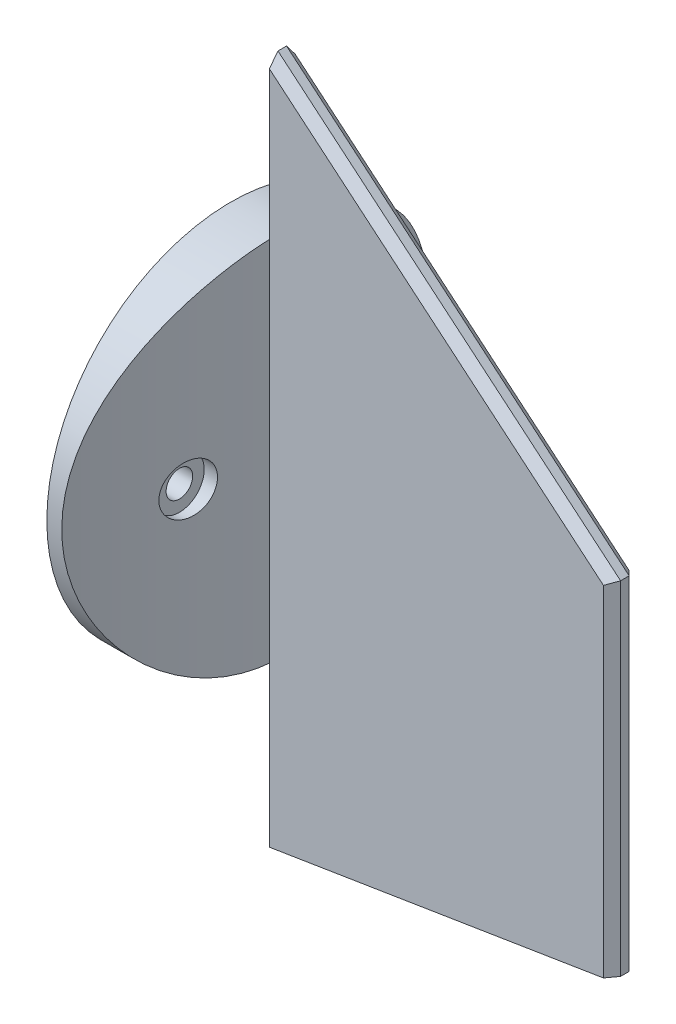
ISO-10303-21;
HEADER;
FILE_DESCRIPTION(('STEP AP214'),'2;1');
FILE_NAME('part.step','',(''),(''),'','','');
FILE_SCHEMA(('AUTOMOTIVE_DESIGN { 1 0 10303 214 1 1 1 1 }'));
ENDSEC;
DATA;
#1=APPLICATION_CONTEXT('core data for automotive mechanical design processes');
#2=APPLICATION_PROTOCOL_DEFINITION('international standard','automotive_design',2000,#1);
#3=PRODUCT_CONTEXT('',#1,'mechanical');
#4=PRODUCT('Part','Part','',(#3));
#5=PRODUCT_RELATED_PRODUCT_CATEGORY('part','',(#4));
#6=PRODUCT_DEFINITION_FORMATION('','',#4);
#7=PRODUCT_DEFINITION_CONTEXT('part definition',#1,'design');
#8=PRODUCT_DEFINITION('design','',#6,#7);
#9=PRODUCT_DEFINITION_SHAPE('','',#8);
#10=(LENGTH_UNIT() NAMED_UNIT(*) SI_UNIT(.MILLI.,.METRE.));
#11=(NAMED_UNIT(*) PLANE_ANGLE_UNIT() SI_UNIT($,.RADIAN.));
#12=(NAMED_UNIT(*) SI_UNIT($,.STERADIAN.) SOLID_ANGLE_UNIT());
#13=UNCERTAINTY_MEASURE_WITH_UNIT(LENGTH_MEASURE(1.E-05),#10,'distance_accuracy_value','');
#14=(GEOMETRIC_REPRESENTATION_CONTEXT(3) GLOBAL_UNCERTAINTY_ASSIGNED_CONTEXT((#13)) GLOBAL_UNIT_ASSIGNED_CONTEXT((#10,
#11,#12)) REPRESENTATION_CONTEXT('',''));
#15=CARTESIAN_POINT('',(0.,0.,0.));
#16=DIRECTION('',(0.,0.,1.));
#17=DIRECTION('',(1.,0.,0.));
#18=AXIS2_PLACEMENT_3D('',#15,#16,#17);
#19=CARTESIAN_POINT('',(16.1628836517053,19.2621746586022,-1.143));
#20=DIRECTION('',(0.642787609686535,0.766044443118982,0.));
#21=DIRECTION('',(-0.766044443118982,0.642787609686535,0.));
#22=AXIS2_PLACEMENT_3D('',#19,#20,#21);
#23=PLANE('',#22);
#24=DIRECTION('',(0.,0.,1.));
#25=VECTOR('',#24,1.);
#26=CARTESIAN_POINT('',(33.274,4.90424324171679,-1.143));
#27=LINE('',#26,#25);
#28=CARTESIAN_POINT('',(33.274,4.90424324171679,-0.380999999999998));
#29=VERTEX_POINT('',#28);
#30=CARTESIAN_POINT('',(33.274,4.90424324171679,0.381000000000004));
#31=VERTEX_POINT('',#30);
#32=EDGE_CURVE('E153',#29,#31,#27,.T.);
#33=ORIENTED_EDGE('',*,*,#32,.F.);
#34=DIRECTION('',(-0.766044443118982,0.642787609686535,0.));
#35=VECTOR('',#34,1.);
#36=CARTESIAN_POINT('',(16.1628836517053,19.2621746586022,-0.380999999999998));
#37=LINE('',#36,#35);
#38=CARTESIAN_POINT('',(2.794,30.48,-0.380999999999998));
#39=VERTEX_POINT('',#38);
#40=EDGE_CURVE('E84',#29,#39,#37,.T.);
#41=ORIENTED_EDGE('',*,*,#40,.T.);
#42=DIRECTION('',(0.,0.,1.));
#43=VECTOR('',#42,1.);
#44=CARTESIAN_POINT('',(2.794,30.48,-1.143));
#45=LINE('',#44,#43);
#46=CARTESIAN_POINT('',(2.794,30.48,0.381000000000004));
#47=VERTEX_POINT('',#46);
#48=EDGE_CURVE('E130',#39,#47,#45,.T.);
#49=ORIENTED_EDGE('',*,*,#48,.T.);
#50=DIRECTION('',(0.766044443118982,-0.642787609686535,0.));
#51=VECTOR('',#50,1.);
#52=CARTESIAN_POINT('',(33.274,4.9042432417168,0.381000000000004));
#53=LINE('',#52,#51);
#54=EDGE_CURVE('E173',#47,#31,#53,.T.);
#55=ORIENTED_EDGE('',*,*,#54,.T.);
#56=EDGE_LOOP('',(#33,#41,#49,#55));
#57=FACE_BOUND('',#56,.T.);
#58=ADVANCED_FACE('F60',(#57),#23,.T.);
#59=CARTESIAN_POINT('',(33.274,0.,-1.143));
#60=DIRECTION('',(1.,0.,0.));
#61=DIRECTION('',(0.,0.,-1.));
#62=AXIS2_PLACEMENT_3D('',#59,#60,#61);
#63=PLANE('',#62);
#64=ORIENTED_EDGE('',*,*,#32,.T.);
#65=DIRECTION('',(0.,-1.,0.));
#66=VECTOR('',#65,1.);
#67=CARTESIAN_POINT('',(33.274,-25.5757567582832,0.381));
#68=LINE('',#67,#66);
#69=CARTESIAN_POINT('',(33.274,-25.5757567582832,0.381));
#70=VERTEX_POINT('',#69);
#71=EDGE_CURVE('E164',#31,#70,#68,.T.);
#72=ORIENTED_EDGE('',*,*,#71,.T.);
#73=DIRECTION('',(0.,0.,1.));
#74=VECTOR('',#73,1.);
#75=CARTESIAN_POINT('',(33.274,-25.5757567582832,-1.143));
#76=LINE('',#75,#74);
#77=CARTESIAN_POINT('',(33.274,-25.5757567582832,-0.381));
#78=VERTEX_POINT('',#77);
#79=EDGE_CURVE('E140',#78,#70,#76,.T.);
#80=ORIENTED_EDGE('',*,*,#79,.F.);
#81=DIRECTION('',(0.,1.,0.));
#82=VECTOR('',#81,1.);
#83=CARTESIAN_POINT('',(33.274,0.,-0.381));
#84=LINE('',#83,#82);
#85=EDGE_CURVE('E161',#78,#29,#84,.T.);
#86=ORIENTED_EDGE('',*,*,#85,.T.);
#87=EDGE_LOOP('',(#64,#72,#80,#86));
#88=FACE_BOUND('',#87,.T.);
#89=ADVANCED_FACE('F188',(#88),#63,.T.);
#90=CARTESIAN_POINT('',(4.85098997494497,-30.1490295543667,-1.143));
#91=DIRECTION('',(0.158857187077337,-0.987301572020361,0.));
#92=DIRECTION('',(0.987301572020361,0.158857187077337,0.));
#93=AXIS2_PLACEMENT_3D('',#90,#91,#92);
#94=PLANE('',#93);
#95=ORIENTED_EDGE('',*,*,#79,.T.);
#96=DIRECTION('',(-0.702574178847774,-0.113044444501933,0.702574178847775));
#97=VECTOR('',#96,1.);
#98=CARTESIAN_POINT('',(19.6331478716564,-27.77057489679,14.0218521283436));
#99=LINE('',#98,#97);
#100=CARTESIAN_POINT('',(32.512,-25.6983628393261,1.143));
#101=VERTEX_POINT('',#100);
#102=EDGE_CURVE('E168',#70,#101,#99,.T.);
#103=ORIENTED_EDGE('',*,*,#102,.T.);
#104=DIRECTION('',(0.987301572020361,0.158857187077337,0.));
#105=VECTOR('',#104,1.);
#106=CARTESIAN_POINT('',(4.85098997494497,-30.1490295543667,1.143));
#107=LINE('',#106,#105);
#108=CARTESIAN_POINT('',(2.794,-30.48,1.143));
#109=VERTEX_POINT('',#108);
#110=EDGE_CURVE('E139',#109,#101,#107,.T.);
#111=ORIENTED_EDGE('',*,*,#110,.F.);
#112=DIRECTION('',(0.,0.,1.));
#113=VECTOR('',#112,1.);
#114=CARTESIAN_POINT('',(2.794,-30.48,-1.143));
#115=LINE('',#114,#113);
#116=CARTESIAN_POINT('',(2.794,-30.48,-1.143));
#117=VERTEX_POINT('',#116);
#118=EDGE_CURVE('E124',#117,#109,#115,.T.);
#119=ORIENTED_EDGE('',*,*,#118,.F.);
#120=DIRECTION('',(0.987301572020361,0.158857187077337,0.));
#121=VECTOR('',#120,1.);
#122=CARTESIAN_POINT('',(4.85098997494497,-30.1490295543667,-1.143));
#123=LINE('',#122,#121);
#124=CARTESIAN_POINT('',(32.512,-25.6983628393261,-1.143));
#125=VERTEX_POINT('',#124);
#126=EDGE_CURVE('E131',#117,#125,#123,.T.);
#127=ORIENTED_EDGE('',*,*,#126,.T.);
#128=DIRECTION('',(-0.702574178847774,-0.113044444501933,-0.702574178847775));
#129=VECTOR('',#128,1.);
#130=CARTESIAN_POINT('',(18.504754321729,-27.9521338351505,-15.150245678271));
#131=LINE('',#130,#129);
#132=EDGE_CURVE('E166',#125,#78,#131,.F.);
#133=ORIENTED_EDGE('',*,*,#132,.T.);
#134=EDGE_LOOP('',(#95,#103,#111,#119,#127,#133));
#135=FACE_BOUND('',#134,.T.);
#136=ADVANCED_FACE('F136',(#135),#94,.T.);
#137=CARTESIAN_POINT('',(2.794,0.,-1.143));
#138=DIRECTION('',(-1.,0.,0.));
#139=DIRECTION('',(0.,-1.,0.));
#140=AXIS2_PLACEMENT_3D('',#137,#138,#139);
#141=PLANE('',#140);
#142=ORIENTED_EDGE('',*,*,#48,.F.);
#143=DIRECTION('',(0.,0.793844806099445,0.608120402411344));
#144=VECTOR('',#143,1.);
#145=CARTESIAN_POINT('',(2.794,10.9039637624277,-15.3771137780881));
#146=LINE('',#145,#144);
#147=CARTESIAN_POINT('',(2.794,29.4852796455288,-1.143));
#148=VERTEX_POINT('',#147);
#149=EDGE_CURVE('E14',#39,#148,#146,.F.);
#150=ORIENTED_EDGE('',*,*,#149,.T.);
#151=DIRECTION('',(0.,-1.,0.));
#152=VECTOR('',#151,1.);
#153=CARTESIAN_POINT('',(2.794,0.,-1.143));
#154=LINE('',#153,#152);
#155=EDGE_CURVE('E121',#148,#117,#154,.T.);
#156=ORIENTED_EDGE('',*,*,#155,.T.);
#157=ORIENTED_EDGE('',*,*,#118,.T.);
#158=DIRECTION('',(0.,-1.,0.));
#159=VECTOR('',#158,1.);
#160=CARTESIAN_POINT('',(2.794,0.,1.143));
#161=LINE('',#160,#159);
#162=CARTESIAN_POINT('',(2.794,29.4852796455288,1.143));
#163=VERTEX_POINT('',#162);
#164=EDGE_CURVE('E145',#163,#109,#161,.T.);
#165=ORIENTED_EDGE('',*,*,#164,.F.);
#166=DIRECTION('',(0.,0.793844806099445,-0.608120402411344));
#167=VECTOR('',#166,1.);
#168=CARTESIAN_POINT('',(2.794,12.0075376300625,14.5317271492151));
#169=LINE('',#168,#167);
#170=EDGE_CURVE('E70',#163,#47,#169,.T.);
#171=ORIENTED_EDGE('',*,*,#170,.T.);
#172=EDGE_LOOP('',(#142,#150,#156,#157,#165,#171));
#173=FACE_BOUND('',#172,.T.);
#174=ADVANCED_FACE('F123',(#173),#141,.T.);
#175=CARTESIAN_POINT('',(0.,0.,-1.143));
#176=DIRECTION('',(0.,0.,-1.));
#177=DIRECTION('',(-1.,0.,0.));
#178=AXIS2_PLACEMENT_3D('',#175,#176,#177);
#179=PLANE('',#178);
#180=DIRECTION('',(0.766044443118982,-0.642787609686535,0.));
#181=VECTOR('',#180,1.);
#182=CARTESIAN_POINT('',(15.6730794931242,18.6784487929456,-1.143));
#183=LINE('',#182,#181);
#184=CARTESIAN_POINT('',(32.512,4.54891680620268,-1.143));
#185=VERTEX_POINT('',#184);
#186=EDGE_CURVE('E170',#148,#185,#183,.T.);
#187=ORIENTED_EDGE('',*,*,#186,.T.);
#188=DIRECTION('',(0.,-1.,0.));
#189=VECTOR('',#188,1.);
#190=CARTESIAN_POINT('',(32.512,0.,-1.143));
#191=LINE('',#190,#189);
#192=EDGE_CURVE('E144',#185,#125,#191,.T.);
#193=ORIENTED_EDGE('',*,*,#192,.T.);
#194=ORIENTED_EDGE('',*,*,#126,.F.);
#195=ORIENTED_EDGE('',*,*,#155,.F.);
#196=EDGE_LOOP('',(#187,#193,#194,#195));
#197=FACE_BOUND('',#196,.T.);
#198=ADVANCED_FACE('F142',(#197),#179,.T.);
#199=CARTESIAN_POINT('',(0.,0.,1.143));
#200=DIRECTION('',(0.,0.,-1.));
#201=DIRECTION('',(-1.,0.,0.));
#202=AXIS2_PLACEMENT_3D('',#199,#200,#201);
#203=PLANE('',#202);
#204=ORIENTED_EDGE('',*,*,#110,.T.);
#205=DIRECTION('',(0.,1.,0.));
#206=VECTOR('',#205,1.);
#207=CARTESIAN_POINT('',(32.512,4.90424324171679,1.143));
#208=LINE('',#207,#206);
#209=CARTESIAN_POINT('',(32.512,4.54891680620268,1.143));
#210=VERTEX_POINT('',#209);
#211=EDGE_CURVE('E158',#101,#210,#208,.T.);
#212=ORIENTED_EDGE('',*,*,#211,.T.);
#213=DIRECTION('',(-0.766044443118982,0.642787609686535,0.));
#214=VECTOR('',#213,1.);
#215=CARTESIAN_POINT('',(2.30419584141886,29.8962741343433,1.143));
#216=LINE('',#215,#214);
#217=EDGE_CURVE('E156',#210,#163,#216,.T.);
#218=ORIENTED_EDGE('',*,*,#217,.T.);
#219=ORIENTED_EDGE('',*,*,#164,.T.);
#220=EDGE_LOOP('',(#204,#212,#218,#219));
#221=FACE_BOUND('',#220,.T.);
#222=ADVANCED_FACE('F193',(#221),#203,.F.);
#223=CARTESIAN_POINT('',(15.6730794931242,18.6784487929456,1.143));
#224=DIRECTION('',(0.45451947767204,0.541675220419704,0.707106781186548));
#225=DIRECTION('',(0.766044443118982,-0.642787609686535,0.));
#226=AXIS2_PLACEMENT_3D('',#223,#224,#225);
#227=PLANE('',#226);
#228=ORIENTED_EDGE('',*,*,#170,.F.);
#229=ORIENTED_EDGE('',*,*,#217,.F.);
#230=DIRECTION('',(0.671542934237816,0.313145613014978,-0.671542934237817));
#231=VECTOR('',#230,1.);
#232=CARTESIAN_POINT('',(27.8894630005605,2.39339240325919,5.76553699943948));
#233=LINE('',#232,#231);
#234=EDGE_CURVE('E149',#31,#210,#233,.F.);
#235=ORIENTED_EDGE('',*,*,#234,.F.);
#236=ORIENTED_EDGE('',*,*,#54,.F.);
#237=EDGE_LOOP('',(#228,#229,#235,#236));
#238=FACE_BOUND('',#237,.T.);
#239=ADVANCED_FACE('F191',(#238),#227,.T.);
#240=CARTESIAN_POINT('',(32.512,0.,1.143));
#241=DIRECTION('',(0.707106781186548,0.,0.707106781186547));
#242=DIRECTION('',(0.,-1.,0.));
#243=AXIS2_PLACEMENT_3D('',#240,#241,#242);
#244=PLANE('',#243);
#245=ORIENTED_EDGE('',*,*,#102,.F.);
#246=ORIENTED_EDGE('',*,*,#71,.F.);
#247=ORIENTED_EDGE('',*,*,#234,.T.);
#248=ORIENTED_EDGE('',*,*,#211,.F.);
#249=EDGE_LOOP('',(#245,#246,#247,#248));
#250=FACE_BOUND('',#249,.T.);
#251=ADVANCED_FACE('F195',(#250),#244,.T.);
#252=CARTESIAN_POINT('',(16.1628836517053,19.2621746586022,-0.381));
#253=DIRECTION('',(-0.45451947767204,-0.541675220419704,0.707106781186548));
#254=DIRECTION('',(-0.766044443118982,0.642787609686535,0.));
#255=AXIS2_PLACEMENT_3D('',#252,#253,#254);
#256=PLANE('',#255);
#257=ORIENTED_EDGE('',*,*,#149,.F.);
#258=ORIENTED_EDGE('',*,*,#40,.F.);
#259=DIRECTION('',(-0.671542934237816,-0.313145613014978,-0.671542934237818));
#260=VECTOR('',#259,1.);
#261=CARTESIAN_POINT('',(28.5767411472482,2.71387546634224,-5.07825885275177));
#262=LINE('',#261,#260);
#263=EDGE_CURVE('E65',#185,#29,#262,.F.);
#264=ORIENTED_EDGE('',*,*,#263,.F.);
#265=ORIENTED_EDGE('',*,*,#186,.F.);
#266=EDGE_LOOP('',(#257,#258,#264,#265));
#267=FACE_BOUND('',#266,.T.);
#268=ADVANCED_FACE('F63',(#267),#256,.F.);
#269=CARTESIAN_POINT('',(33.274,0.,-0.381));
#270=DIRECTION('',(-0.707106781186548,0.,0.707106781186547));
#271=DIRECTION('',(0.,1.,0.));
#272=AXIS2_PLACEMENT_3D('',#269,#270,#271);
#273=PLANE('',#272);
#274=ORIENTED_EDGE('',*,*,#132,.F.);
#275=ORIENTED_EDGE('',*,*,#192,.F.);
#276=ORIENTED_EDGE('',*,*,#263,.T.);
#277=ORIENTED_EDGE('',*,*,#85,.F.);
#278=EDGE_LOOP('',(#274,#275,#276,#277));
#279=FACE_BOUND('',#278,.T.);
#280=ADVANCED_FACE('F184',(#279),#273,.F.);
#281=CLOSED_SHELL('',(#58,#89,#136,#174,#198,#222,#239,#251,#268,#280));
#282=MANIFOLD_SOLID_BREP('B2',#281);
#283=CARTESIAN_POINT('',(-0.9398,0.,0.));
#284=DIRECTION('',(1.,0.,0.));
#285=DIRECTION('',(0.,0.,-1.));
#286=AXIS2_PLACEMENT_3D('',#283,#284,#285);
#287=CYLINDRICAL_SURFACE('',#286,5.4102);
#288=CARTESIAN_POINT('',(-1.778,0.,0.));
#289=DIRECTION('',(-1.,0.,0.));
#290=DIRECTION('',(0.,0.,1.));
#291=AXIS2_PLACEMENT_3D('',#288,#289,#290);
#292=CIRCLE('',#291,5.4102);
#293=CARTESIAN_POINT('',(-1.778,0.,5.4102));
#294=VERTEX_POINT('',#293);
#295=EDGE_CURVE('E394',#294,#294,#292,.T.);
#296=ORIENTED_EDGE('',*,*,#295,.T.);
#297=EDGE_LOOP('',(#296));
#298=FACE_BOUND('',#297,.T.);
#299=CARTESIAN_POINT('',(1.016,0.,0.));
#300=DIRECTION('',(-1.,0.,0.));
#301=DIRECTION('',(0.,0.,1.));
#302=AXIS2_PLACEMENT_3D('',#299,#300,#301);
#303=CIRCLE('',#302,5.4102);
#304=CARTESIAN_POINT('',(1.016,0.,5.4102));
#305=VERTEX_POINT('',#304);
#306=EDGE_CURVE('E393',#305,#305,#303,.F.);
#307=ORIENTED_EDGE('',*,*,#306,.T.);
#308=EDGE_LOOP('',(#307));
#309=FACE_BOUND('',#308,.T.);
#310=ADVANCED_FACE('F295',(#298,#309),#287,.F.);
#311=CARTESIAN_POINT('',(-1.778,0.,0.));
#312=DIRECTION('',(-1.,0.,0.));
#313=DIRECTION('',(0.,0.,1.));
#314=AXIS2_PLACEMENT_3D('',#311,#312,#313);
#315=PLANE('',#314);
#316=CARTESIAN_POINT('',(-1.778,0.,-7.62482003100001));
#317=DIRECTION('',(-1.,0.,0.));
#318=DIRECTION('',(0.,0.,1.));
#319=AXIS2_PLACEMENT_3D('',#316,#317,#318);
#320=CIRCLE('',#319,1.1811);
#321=CARTESIAN_POINT('',(-1.778,0.,-6.44372003100001));
#322=VERTEX_POINT('',#321);
#323=EDGE_CURVE('E396',#322,#322,#320,.T.);
#324=ORIENTED_EDGE('',*,*,#323,.F.);
#325=EDGE_LOOP('',(#324));
#326=FACE_BOUND('',#325,.T.);
#327=CARTESIAN_POINT('',(-1.778,0.,0.));
#328=DIRECTION('',(-1.,0.,0.));
#329=DIRECTION('',(0.,0.,1.));
#330=AXIS2_PLACEMENT_3D('',#327,#328,#329);
#331=CIRCLE('',#330,16.367500031);
#332=CARTESIAN_POINT('',(-1.778,0.,16.367500031));
#333=VERTEX_POINT('',#332);
#334=EDGE_CURVE('E330',#333,#333,#331,.T.);
#335=ORIENTED_EDGE('',*,*,#334,.T.);
#336=EDGE_LOOP('',(#335));
#337=FACE_BOUND('',#336,.T.);
#338=CARTESIAN_POINT('',(-1.778,0.,7.62482003100001));
#339=DIRECTION('',(-1.,0.,0.));
#340=DIRECTION('',(0.,0.,1.));
#341=AXIS2_PLACEMENT_3D('',#338,#339,#340);
#342=CIRCLE('',#341,1.1811);
#343=CARTESIAN_POINT('',(-1.778,0.,8.80592003100001));
#344=VERTEX_POINT('',#343);
#345=EDGE_CURVE('E400',#344,#344,#342,.T.);
#346=ORIENTED_EDGE('',*,*,#345,.F.);
#347=EDGE_LOOP('',(#346));
#348=FACE_BOUND('',#347,.T.);
#349=ORIENTED_EDGE('',*,*,#295,.F.);
#350=EDGE_LOOP('',(#349));
#351=FACE_BOUND('',#350,.T.);
#352=ADVANCED_FACE('F338',(#326,#337,#348,#351),#315,.T.);
#353=CARTESIAN_POINT('',(-40.095840306,52.8319999999999,0.));
#354=DIRECTION('',(0.,-1.,0.));
#355=DIRECTION('',(0.,0.,-1.));
#356=AXIS2_PLACEMENT_3D('',#353,#354,#355);
#357=CYLINDRICAL_SURFACE('',#356,42.889840306);
#358=CARTESIAN_POINT('',(1.65123923640673,0.,-9.83462003100001));
#359=CARTESIAN_POINT('',(1.65124090493236,-0.121723263479256,-9.83461473170668));
#360=CARTESIAN_POINT('',(1.65362331999181,-0.24361646545623,-9.82451669951309));
#361=CARTESIAN_POINT('',(1.66304179473204,-0.484071798545726,-9.78440474082203));
#362=CARTESIAN_POINT('',(1.67008801002888,-0.60262607034073,-9.75434735154099));
#363=CARTESIAN_POINT('',(1.68846480315277,-0.832716651604852,-9.67532327176787));
#364=CARTESIAN_POINT('',(1.69978897156905,-0.944263170218925,-9.62638486729045));
#365=CARTESIAN_POINT('',(1.72616179018139,-1.15743141954963,-9.5111523137065));
#366=CARTESIAN_POINT('',(1.74120889976679,-1.25905723141008,-9.44486534305095));
#367=CARTESIAN_POINT('',(1.77456103149235,-1.45109086448671,-9.29590118356578));
#368=CARTESIAN_POINT('',(1.79290670266065,-1.54133160494938,-9.21301783027845));
#369=CARTESIAN_POINT('',(1.83192074067876,-1.70670673527771,-9.03380609372992));
#370=CARTESIAN_POINT('',(1.85258957336221,-1.78183808699815,-8.93747501302877));
#371=CARTESIAN_POINT('',(1.89593570307429,-1.9167172743674,-8.73157834471528));
#372=CARTESIAN_POINT('',(1.91864914504905,-1.97605547733748,-8.62175190966475));
#373=CARTESIAN_POINT('',(1.964779660835,-2.07540842874624,-8.3938169103199));
#374=CARTESIAN_POINT('',(1.98819679496326,-2.1154215156831,-8.27570763489705));
#375=CARTESIAN_POINT('',(2.03527928488527,-2.17550896913286,-8.0326028935171));
#376=CARTESIAN_POINT('',(2.05894306584235,-2.19527389254562,-7.90753049483763));
#377=CARTESIAN_POINT('',(2.10540722034292,-2.21318785749976,-7.65568437231601));
#378=CARTESIAN_POINT('',(2.12820758233017,-2.21133660982661,-7.52891062573325));
#379=CARTESIAN_POINT('',(2.17230132914126,-2.18596071733981,-7.27728792170877));
#380=CARTESIAN_POINT('',(2.19359483948715,-2.16243788008219,-7.15243880462302));
#381=CARTESIAN_POINT('',(2.2341613843216,-2.09424977318596,-6.90830496973448));
#382=CARTESIAN_POINT('',(2.25343450606202,-2.0495854170181,-6.78902001176327));
#383=CARTESIAN_POINT('',(2.28938124241434,-1.94086540100623,-6.56083892551603));
#384=CARTESIAN_POINT('',(2.3060808461004,-1.87702589247168,-6.45184393038169));
#385=CARTESIAN_POINT('',(2.33687957748199,-1.7315211537319,-6.24608055642361));
#386=CARTESIAN_POINT('',(2.35097910815996,-1.64985869017796,-6.14931028363718));
#387=CARTESIAN_POINT('',(2.37626734323462,-1.47220211311279,-5.97213489279955));
#388=CARTESIAN_POINT('',(2.38749230320028,-1.37641328784823,-5.89152904202702));
#389=CARTESIAN_POINT('',(2.40721897450267,-1.17236895752072,-5.74749151314544));
#390=CARTESIAN_POINT('',(2.41571955722137,-1.0641083109832,-5.68406695434826));
#391=CARTESIAN_POINT('',(2.42991693515785,-0.839302464759715,-5.57685243955172));
#392=CARTESIAN_POINT('',(2.43563784839463,-0.722838948397243,-5.53289389219598));
#393=CARTESIAN_POINT('',(2.44439168883627,-0.484261529759884,-5.46518495316809));
#394=CARTESIAN_POINT('',(2.44743036660701,-0.36216030918075,-5.44139133338875));
#395=CARTESIAN_POINT('',(2.44969089769505,-0.199378778292938,-5.42366884137227));
#396=CARTESIAN_POINT('',(2.45010388878268,-0.159577867125906,-5.42042793362256));
#397=CARTESIAN_POINT('',(2.45065470711853,-0.0798570519826655,-5.41610267137195));
#398=CARTESIAN_POINT('',(2.45079253424848,-0.0399371479553198,-5.41501831779795));
#399=CARTESIAN_POINT('',(2.45079222198178,0.123202682239974,-5.41502531608168));
#400=CARTESIAN_POINT('',(2.44947959966393,0.246569469713518,-5.42536636933804));
#401=CARTESIAN_POINT('',(2.44421635351448,0.489970986763301,-5.46647924044991));
#402=CARTESIAN_POINT('',(2.44026017230809,0.609998140794525,-5.49729409822086));
#403=CARTESIAN_POINT('',(2.42969496072536,0.843038194641958,-5.57843297927342));
#404=CARTESIAN_POINT('',(2.42308841090257,0.956057539383714,-5.62873875895838));
#405=CARTESIAN_POINT('',(2.40721899317267,1.17194250541552,-5.7473396386006));
#406=CARTESIAN_POINT('',(2.39795735267357,1.27481278899353,-5.81562642502626));
#407=CARTESIAN_POINT('',(2.37676990619326,1.4678766539148,-5.96839408424807));
#408=CARTESIAN_POINT('',(2.36483688513589,1.55803480581141,-6.05291872413217));
#409=CARTESIAN_POINT('',(2.33839853471997,1.72288254413611,-6.23556522860688));
#410=CARTESIAN_POINT('',(2.32389291843296,1.79757040310437,-6.33368860963453));
#411=CARTESIAN_POINT('',(2.29234907824378,1.92999345732127,-6.54147620732075));
#412=CARTESIAN_POINT('',(2.27529243564043,1.9875954300748,-6.65122250465698));
#413=CARTESIAN_POINT('',(2.23899476606412,2.0836021914911,-6.8784716028277));
#414=CARTESIAN_POINT('',(2.21975363242519,2.1220060422384,-6.99597478230371));
#415=CARTESIAN_POINT('',(2.1792263051758,2.17903864879861,-7.2368659574205));
#416=CARTESIAN_POINT('',(2.1579184601324,2.19742612157519,-7.36030742044492));
#417=CARTESIAN_POINT('',(2.11397100683158,2.21322912397292,-7.60829089112522));
#418=CARTESIAN_POINT('',(2.09133129310549,2.21064299050071,-7.73283298527303));
#419=CARTESIAN_POINT('',(2.04505754538407,2.18449310446752,-7.98118340912612));
#420=CARTESIAN_POINT('',(2.02141447601561,2.16066038457447,-8.10496177686636));
#421=CARTESIAN_POINT('',(1.97417544823959,2.0923402630411,-8.34669727486986));
#422=CARTESIAN_POINT('',(1.95057949325134,2.04785141336171,-8.46465399638178));
#423=CARTESIAN_POINT('',(1.90414045338888,1.93907274101994,-8.69215688712455));
#424=CARTESIAN_POINT('',(1.88130294731311,1.87466178929059,-8.8016463391349));
#425=CARTESIAN_POINT('',(1.83745737907376,1.72784863549205,-9.00822472805835));
#426=CARTESIAN_POINT('',(1.81644912221774,1.6454483513633,-9.10531498516931));
#427=CARTESIAN_POINT('',(1.77735399506801,1.46563194978267,-9.28344033985892));
#428=CARTESIAN_POINT('',(1.75924410957872,1.3683475106771,-9.36460321361671));
#429=CARTESIAN_POINT('',(1.72658928869166,1.16088131449001,-9.50938033448004));
#430=CARTESIAN_POINT('',(1.71204563352437,1.05069494669518,-9.57298828061953));
#431=CARTESIAN_POINT('',(1.68754102408532,0.823083609925416,-9.67937892269558));
#432=CARTESIAN_POINT('',(1.67749042235978,0.705858719697059,-9.72257009559211));
#433=CARTESIAN_POINT('',(1.66207643546337,0.465697615563304,-9.78856267986493));
#434=CARTESIAN_POINT('',(1.65670202686647,0.342775557006191,-9.81141204697337));
#435=CARTESIAN_POINT('',(1.65294626910597,0.182559782974134,-9.82737118451738));
#436=CARTESIAN_POINT('',(1.65230679959527,0.146107882189118,-9.83008739658524));
#437=CARTESIAN_POINT('',(1.65145303242641,0.0731090984650256,-9.8337126166844));
#438=CARTESIAN_POINT('',(1.65123873522897,0.0365622154230704,-9.8346216227574));
#439=CARTESIAN_POINT('',(1.65123923640673,0.,-9.83462003100001));
#440=B_SPLINE_CURVE_WITH_KNOTS('',3,(#358,#359,#360,#361,#362,#363,#364,#365,#366,#367,#368,
#369,#370,#371,#372,#373,#374,#375,#376,#377,#378,#379,#380,#381,#382,#383,#384,#385,#386,#387,
#388,#389,#390,#391,#392,#393,#394,#395,#396,#397,#398,#399,#400,#401,#402,#403,#404,#405,#406,
#407,#408,#409,#410,#411,#412,#413,#414,#415,#416,#417,#418,#419,#420,#421,#422,#423,#424,#425,
#426,#427,#428,#429,#430,#431,#432,#433,#434,#435,#436,#437,#438,#439),.UNSPECIFIED.,.T.,.F.,(4,
2,2,2,2,2,2,2,2,2,2,2,2,2,2,2,2,2,2,2,2,2,2,2,2,2,2,2,2,2,2,2,2,2,2,2,2,2,2,2,4),(0.,
0.365028233526957,0.730853957577828,1.09613374588538,1.46126262784271,1.83124522919189,
2.20130215118106,2.58018491938728,2.95910025673257,3.34372368729796,3.72835226395604,
4.11294876291359,4.49752864596058,4.87792643763192,5.25826522222754,5.63354015415093,
6.00897034952752,6.3810821918068,6.75239429528886,6.87215640254757,6.9919185612805,
7.36137456758455,7.73160971000847,8.10149914449368,8.47121785970403,8.84194745325271,
9.21271842130228,9.58630864831107,9.95991712511614,10.3379809513626,10.7160747563158,
11.0990240282616,11.4820001498281,11.8673521794359,12.2526631446169,12.6347438139049,
13.0169614450545,13.3911693930552,13.7644927930035,13.8741368007821,13.9837809273709),.UNSPECIFIED.);
#441=CARTESIAN_POINT('',(1.65123923640673,0.,-9.83462003100001));
#442=VERTEX_POINT('',#441);
#443=EDGE_CURVE('E59',#442,#442,#440,.T.);
#444=ORIENTED_EDGE('',*,*,#443,.T.);
#445=EDGE_LOOP('',(#444));
#446=FACE_BOUND('',#445,.T.);
#447=CARTESIAN_POINT('',(2.4507924578046,0.,5.41502003100001));
#448=CARTESIAN_POINT('',(2.45079223647605,0.123304288673363,5.41502554931877));
#449=CARTESIAN_POINT('',(2.44947837581417,0.246696326644531,5.42537614682885));
#450=CARTESIAN_POINT('',(2.44421266941021,0.490070854615563,5.4665078021759));
#451=CARTESIAN_POINT('',(2.44025771578404,0.610049153904073,5.49731292946689));
#452=CARTESIAN_POINT('',(2.42969555197143,0.843028322687669,5.57842847299902));
#453=CARTESIAN_POINT('',(2.42308988431814,0.956033206179598,5.6287275445251));
#454=CARTESIAN_POINT('',(2.40722105409386,1.17191875525005,5.74732443801676));
#455=CARTESIAN_POINT('',(2.39795852884566,1.2748018408902,5.81561794318666));
#456=CARTESIAN_POINT('',(2.37676965889334,1.46787913857616,5.9683958686522));
#457=CARTESIAN_POINT('',(2.36483633034585,1.55803905439682,6.05292265333881));
#458=CARTESIAN_POINT('',(2.33839786210826,1.72288594849068,6.23556977882074));
#459=CARTESIAN_POINT('',(2.32389255443536,1.79757191542771,6.33369100741385));
#460=CARTESIAN_POINT('',(2.29234914776538,1.92999318134708,6.54147574933223));
#461=CARTESIAN_POINT('',(2.27529258491427,1.98759493092401,6.65122154457576));
#462=CARTESIAN_POINT('',(2.23899493402375,2.08360185158127,6.87847057679612));
#463=CARTESIAN_POINT('',(2.2197537203004,2.12200591752283,6.99597425992482));
#464=CARTESIAN_POINT('',(2.17922628266852,2.17903868153688,7.23686609125841));
#465=CARTESIAN_POINT('',(2.15791841316193,2.19742616150882,7.36030769242567));
#466=CARTESIAN_POINT('',(2.11397095710218,2.21322911880547,7.60829116479379));
#467=CARTESIAN_POINT('',(2.091331267997,2.21064297902765,7.73283312009433));
#468=CARTESIAN_POINT('',(2.04505744409797,2.1844930444785,7.98118395266153));
#469=CARTESIAN_POINT('',(2.02141427004068,2.16066016665208,8.10496285512491));
#470=CARTESIAN_POINT('',(1.97417524219937,2.09233988506803,8.34669830499834));
#471=CARTESIAN_POINT('',(1.950579391411,2.04785121278097,8.46465449432721));
#472=CARTESIAN_POINT('',(1.90414145214145,1.93907504229118,8.69215199525008));
#473=CARTESIAN_POINT('',(1.88130490750319,1.87466717364245,8.80163694512784));
#474=CARTESIAN_POINT('',(1.83745918819924,1.72785587200352,9.00821636300243));
#475=CARTESIAN_POINT('',(1.81644997532867,1.64545281537355,9.10531109006722));
#476=CARTESIAN_POINT('',(1.77734924681178,1.46560957463571,9.28346198196888));
#477=CARTESIAN_POINT('',(1.75923525776761,1.36829798702933,9.36464291508045));
#478=CARTESIAN_POINT('',(1.72658219441841,1.16082952940912,9.50941132952608));
#479=CARTESIAN_POINT('',(1.71204266247048,1.05067430644961,9.57300106321749));
#480=CARTESIAN_POINT('',(1.68755440040179,0.823201051227495,9.67932096145829));
#481=CARTESIAN_POINT('',(1.67751249502734,0.706091535132153,9.72247566955817));
#482=CARTESIAN_POINT('',(1.66208866497308,0.465998762078877,9.78851024756722));
#483=CARTESIAN_POINT('',(1.65670603851902,0.34301639262747,9.81139317079716));
#484=CARTESIAN_POINT('',(1.65095704461302,0.0976338972033978,9.83582567675631));
#485=CARTESIAN_POINT('',(1.65048076851834,-0.02471731000389,9.83784268751086));
#486=CARTESIAN_POINT('',(1.65428318593652,-0.267999458520694,9.82169318433141));
#487=CARTESIAN_POINT('',(1.65856159363885,-0.388930484757664,9.80352788358378));
#488=CARTESIAN_POINT('',(1.67160212858868,-0.625067574419067,9.74781798075905));
#489=CARTESIAN_POINT('',(1.68033214294106,-0.740308244315967,9.71041215885207));
#490=CARTESIAN_POINT('',(1.70182260749648,-0.962828491656088,9.61748603853644));
#491=CARTESIAN_POINT('',(1.71458327268509,-1.07010764407341,9.56196477388686));
#492=CARTESIAN_POINT('',(1.74372329335361,-1.27522082050521,9.43364659610963));
#493=CARTESIAN_POINT('',(1.76014789097863,-1.37291260180185,9.36063276915887));
#494=CARTESIAN_POINT('',(1.79577590228138,-1.55472033167787,9.19987267336525));
#495=CARTESIAN_POINT('',(1.81497964983099,-1.63883464656272,9.11212463423141));
#496=CARTESIAN_POINT('',(1.85584776000572,-1.79321220183706,8.9221027816027));
#497=CARTESIAN_POINT('',(1.87755968248382,-1.86309958227621,8.81953379498625));
#498=CARTESIAN_POINT('',(1.9221953620937,-1.98468569168418,8.60436766951226));
#499=CARTESIAN_POINT('',(1.9451192525711,-2.03638241443296,8.49176942625825));
#500=CARTESIAN_POINT('',(1.99178782713501,-2.12105802889116,8.25739005478119));
#501=CARTESIAN_POINT('',(2.01553983287923,-2.15366350103934,8.13547530901443));
#502=CARTESIAN_POINT('',(2.06263364460145,-2.19769896049323,7.88779831514016));
#503=CARTESIAN_POINT('',(2.08597543333445,-2.20912805966995,7.76203590588797));
#504=CARTESIAN_POINT('',(2.13164547976304,-2.21041714845246,7.50961830212828));
#505=CARTESIAN_POINT('',(2.15396865518669,-2.2001789835138,7.38296164648521));
#506=CARTESIAN_POINT('',(2.1968896713799,-2.15809574057701,7.13298529878623));
#507=CARTESIAN_POINT('',(2.21748757411912,-2.12625143901866,7.00966548698285));
#508=CARTESIAN_POINT('',(2.25632748990691,-2.04208808835756,6.77102566592628));
#509=CARTESIAN_POINT('',(2.27458795695329,-1.98994450750679,6.65564681221094));
#510=CARTESIAN_POINT('',(2.30862825911469,-1.86654475260361,6.43520777005953));
#511=CARTESIAN_POINT('',(2.32440836321113,-1.7952906532507,6.33014646320778));
#512=CARTESIAN_POINT('',(2.353088290268,-1.63671696055562,6.13485884626264));
#513=CARTESIAN_POINT('',(2.36602382346741,-1.54962505854923,6.04445286663065));
#514=CARTESIAN_POINT('',(2.38917728655907,-1.36117134042117,5.87951004890773));
#515=CARTESIAN_POINT('',(2.3993947140721,-1.25980689163522,5.80497614491149));
#516=CARTESIAN_POINT('',(2.41697660078634,-1.04688169789713,5.67477618960839));
#517=CARTESIAN_POINT('',(2.424370030993,-0.935439850022081,5.61891931652483));
#518=CARTESIAN_POINT('',(2.43645128720795,-0.704722504586232,5.52673101859226));
#519=CARTESIAN_POINT('',(2.44114243286816,-0.585456819897835,5.49037564070658));
#520=CARTESIAN_POINT('',(2.4465946357545,-0.387854215783384,5.44792463577876));
#521=CARTESIAN_POINT('',(2.44816873208082,-0.310820954714668,5.43560173682911));
#522=CARTESIAN_POINT('',(2.45026771128811,-0.155870150776392,5.41914770399986));
#523=CARTESIAN_POINT('',(2.45079259772786,-0.0779526109070838,5.41501654233501));
#524=CARTESIAN_POINT('',(2.4507924578046,0.,5.41502003100001));
#525=B_SPLINE_CURVE_WITH_KNOTS('',3,(#447,#448,#449,#450,#451,#452,#453,#454,#455,#456,#457,
#458,#459,#460,#461,#462,#463,#464,#465,#466,#467,#468,#469,#470,#471,#472,#473,#474,#475,#476,
#477,#478,#479,#480,#481,#482,#483,#484,#485,#486,#487,#488,#489,#490,#491,#492,#493,#494,#495,
#496,#497,#498,#499,#500,#501,#502,#503,#504,#505,#506,#507,#508,#509,#510,#511,#512,#513,#514,
#515,#516,#517,#518,#519,#520,#521,#522,#523,#524),.UNSPECIFIED.,.T.,.F.,(4,2,2,2,2,2,2,2,2,2,2,
2,2,2,2,2,2,2,2,2,2,2,2,2,2,2,2,2,2,2,2,2,2,2,2,2,2,2,4),(0.,0.369627712743704,
0.739691150066709,1.10953954751339,1.47929930040056,1.85003746968844,2.22079986179968,
2.5943884619213,2.96799856566382,3.34606280641495,3.72415619685325,4.10710713301744,
4.49008159036863,4.87541711658747,5.26074458448075,5.64291821561668,6.02504289099966,
6.39883671334821,6.77257422557942,7.13792082301021,7.50324546014516,7.8659712430563,
8.2287163761878,8.59621647038458,8.9637607507389,9.34002290372178,9.7163265410898,
10.0997639029663,10.4832173456955,10.8684115823947,11.2535919774576,11.6355142460549,
12.017395068711,12.3941667763459,12.7710080732444,13.1438723491849,13.5162775935611,
13.7499559458204,13.9836335054737),.UNSPECIFIED.);
#526=CARTESIAN_POINT('',(2.4507924578046,0.,5.41502003100001));
#527=VERTEX_POINT('',#526);
#528=EDGE_CURVE('E322',#527,#527,#525,.T.);
#529=ORIENTED_EDGE('',*,*,#528,.F.);
#530=EDGE_LOOP('',(#529));
#531=FACE_BOUND('',#530,.T.);
#532=CARTESIAN_POINT('',(-0.451883084130773,0.,-16.367500031));
#533=CARTESIAN_POINT('',(-0.451880550496136,-0.440977166735004,-16.3674973051938));
#534=CARTESIAN_POINT('',(-0.444502700916389,-0.882008020421215,-16.349658970073));
#535=CARTESIAN_POINT('',(-0.415232661133375,-1.76074817233756,-16.2784894417937));
#536=CARTESIAN_POINT('',(-0.393338092334972,-2.19845691434282,-16.2251524320968));
#537=CARTESIAN_POINT('',(-0.335743256611523,-3.06759520432554,-16.0834984874806));
#538=CARTESIAN_POINT('',(-0.300032435643947,-3.49901968978798,-15.9951548102041));
#539=CARTESIAN_POINT('',(-0.215964807888904,-4.35216769721871,-15.7843839792804));
#540=CARTESIAN_POINT('',(-0.167608391314463,-4.77389151808966,-15.6619578773284));
#541=CARTESIAN_POINT('',(-0.0599123346232899,-5.60365591125733,-15.3845675313856));
#542=CARTESIAN_POINT('',(-0.000604921105882387,-6.01173258692127,-15.2296985848455));
#543=CARTESIAN_POINT('',(0.127333523728635,-6.81298892764767,-14.8885142959534));
#544=CARTESIAN_POINT('',(0.195964611916318,-7.20616850182522,-14.7021987617885));
#545=CARTESIAN_POINT('',(0.340615437184315,-7.97535620797049,-14.2995518154783));
#546=CARTESIAN_POINT('',(0.41663441257639,-8.35136610426228,-14.083223496658));
#547=CARTESIAN_POINT('',(0.574062384419578,-9.08437377016514,-13.6219241139421));
#548=CARTESIAN_POINT('',(0.655473327585198,-9.44136458827178,-13.3769426804142));
#549=CARTESIAN_POINT('',(0.825459222732521,-10.150537108204,-12.847817066405));
#550=CARTESIAN_POINT('',(0.914191188438271,-10.5017159118796,-12.5623783678921));
#551=CARTESIAN_POINT('',(1.09285488638436,-11.1790887802288,-11.9635861791476));
#552=CARTESIAN_POINT('',(1.18278665759574,-11.5052820310122,-11.6502317802964));
#553=CARTESIAN_POINT('',(1.3615296635749,-12.1309573386392,-10.997249703863));
#554=CARTESIAN_POINT('',(1.45034024333341,-12.4304243503014,-10.6576074262387));
#555=CARTESIAN_POINT('',(1.62444690040567,-13.0004874633564,-9.95425695835771));
#556=CARTESIAN_POINT('',(1.70974418358758,-13.2710935222372,-9.59055713896201));
#557=CARTESIAN_POINT('',(1.87761368118706,-13.7909461007766,-8.82754553301276));
#558=CARTESIAN_POINT('',(1.95997700007214,-14.0390718302837,-8.42742280755964));
#559=CARTESIAN_POINT('',(2.11627080986971,-14.5005564730267,-7.60597500347019));
#560=CARTESIAN_POINT('',(2.19020063135303,-14.7139126269192,-7.18464824553297));
#561=CARTESIAN_POINT('',(2.32742244553916,-15.1037458095935,-6.32414424885483));
#562=CARTESIAN_POINT('',(2.39072572466883,-15.2802620151198,-5.88498657209326));
#563=CARTESIAN_POINT('',(2.5049170749981,-15.5949582836805,-4.99163977146971));
#564=CARTESIAN_POINT('',(2.55580830902501,-15.7331481142446,-4.53745451049576));
#565=CARTESIAN_POINT('',(2.63140883001164,-15.9367713175857,-3.74589628114686));
#566=CARTESIAN_POINT('',(2.65946186400931,-16.0117477086438,-3.41126164253359));
#567=CARTESIAN_POINT('',(2.70789261163511,-16.1406255832013,-2.73732524819847));
#568=CARTESIAN_POINT('',(2.72826900510439,-16.1945234418669,-2.39802270012169));
#569=CARTESIAN_POINT('',(2.76100267476862,-16.2808858518754,-1.71634484106834));
#570=CARTESIAN_POINT('',(2.77336063508995,-16.3133522317393,-1.37396979476252));
#571=CARTESIAN_POINT('',(2.78985923917849,-16.3566581842099,-0.687740290646745));
#572=CARTESIAN_POINT('',(2.79400152309364,-16.3675020734548,-0.343886141858887));
#573=CARTESIAN_POINT('',(2.79399804104277,-16.3674974040562,0.442296010821252));
#574=CARTESIAN_POINT('',(2.78714125954747,-16.3495530783547,0.884644945638212));
#575=CARTESIAN_POINT('',(2.75989380493716,-16.2779504885287,1.76606063453475));
#576=CARTESIAN_POINT('',(2.7395009610317,-16.2242864960053,2.20512685073865));
#577=CARTESIAN_POINT('',(2.68571286787077,-16.0817382770554,3.07701215969508));
#578=CARTESIAN_POINT('',(2.65230847643789,-15.9928292859975,3.50982663761002));
#579=CARTESIAN_POINT('',(2.57338746447019,-15.7806634452769,4.36579325634127));
#580=CARTESIAN_POINT('',(2.52787125223818,-15.6574077534725,4.78894572235259));
#581=CARTESIAN_POINT('',(2.42603564606608,-15.3780187103868,5.62174754693276));
#582=CARTESIAN_POINT('',(2.36974259085779,-15.2219654276681,6.03142703052227));
#583=CARTESIAN_POINT('',(2.24770841869053,-14.8781247642707,6.83577155722453));
#584=CARTESIAN_POINT('',(2.18196724223981,-14.6903371837701,7.23043650577585));
#585=CARTESIAN_POINT('',(2.04267265554689,-14.284510384067,8.00237142591017));
#586=CARTESIAN_POINT('',(1.9691202426419,-14.0664750258087,8.37964360939796));
#587=CARTESIAN_POINT('',(1.81595360844807,-13.6015916451978,9.11487884144136));
#588=CARTESIAN_POINT('',(1.73633720072151,-13.3547332131176,9.47283484510486));
#589=CARTESIAN_POINT('',(1.56975507458688,-12.8235935918734,10.1810636510078));
#590=CARTESIAN_POINT('',(1.48262344841948,-12.5382221875068,10.5304801094));
#591=CARTESIAN_POINT('',(1.30613810543128,-11.9399396144002,11.204280617593));
#592=CARTESIAN_POINT('',(1.21678432654872,-11.6270276758686,11.528663967212));
#593=CARTESIAN_POINT('',(1.03813022109261,-10.9753544237114,12.1507057992382));
#594=CARTESIAN_POINT('',(0.94882994298164,-10.6365803715712,12.448350952444));
#595=CARTESIAN_POINT('',(0.772724758716548,-9.93536029375185,13.0148673504599));
#596=CARTESIAN_POINT('',(0.685919021844346,-9.57292228321168,13.283748257329));
#597=CARTESIAN_POINT('',(0.513766099271019,-8.81134401221694,13.8012901632779));
#598=CARTESIAN_POINT('',(0.428616165731813,-8.41131554338291,14.048712052625));
#599=CARTESIAN_POINT('',(0.266177443953942,-7.59019485949532,14.5088069902726));
#600=CARTESIAN_POINT('',(0.188888917118509,-7.16910194471229,14.7214788832276));
#601=CARTESIAN_POINT('',(0.044713251118141,-6.30875892020669,15.110173695842));
#602=CARTESIAN_POINT('',(-0.0221772424935698,-5.86951472428568,15.2862084410267));
#603=CARTESIAN_POINT('',(-0.14328507435816,-4.97586391277462,15.6000019332285));
#604=CARTESIAN_POINT('',(-0.197503185978395,-4.52145822439192,15.737763016099));
#605=CARTESIAN_POINT('',(-0.2893315532668,-3.62037518873824,15.9685640839932));
#606=CARTESIAN_POINT('',(-0.327545544073773,-3.17417949866049,16.0632444214696));
#607=CARTESIAN_POINT('',(-0.389228199361866,-2.27443912597651,16.2151196037393));
#608=CARTESIAN_POINT('',(-0.412697254459098,-1.82089463837782,16.2723154415568));
#609=CARTESIAN_POINT('',(-0.444044783268267,-0.910240982297212,16.3485540641287));
#610=CARTESIAN_POINT('',(-0.451929061253436,-0.45313320460062,16.3676110530526));
#611=CARTESIAN_POINT('',(-0.451836710327289,0.461061845942376,16.3673880487887));
#612=CARTESIAN_POINT('',(-0.443860727646671,0.918149118865388,16.3481096175883));
#613=CARTESIAN_POINT('',(-0.413328284767457,1.80011784050763,16.2738471283886));
#614=CARTESIAN_POINT('',(-0.39171314839146,2.22522843377921,16.2211672570596));
#615=CARTESIAN_POINT('',(-0.33548548545617,3.06915719734213,16.0828527690788));
#616=CARTESIAN_POINT('',(-0.300873581456694,3.48797566803402,15.9972197309161));
#617=CARTESIAN_POINT('',(-0.21970502191267,4.31658187503135,15.7938027537704));
#618=CARTESIAN_POINT('',(-0.173147014675058,4.72636858369793,15.6760151764278));
#619=CARTESIAN_POINT('',(-0.0694565088044693,5.53431124102779,15.4093299011922));
#620=CARTESIAN_POINT('',(-0.0123236546768908,5.93246679816552,15.2604311574135));
#621=CARTESIAN_POINT('',(0.112101679039308,6.72237455448528,14.9295553716422));
#622=CARTESIAN_POINT('',(0.17956899064569,7.11385477048163,14.7469952695563));
#623=CARTESIAN_POINT('',(0.321948629317932,7.88010614930244,14.3521690654432));
#624=CARTESIAN_POINT('',(0.396860994501006,8.25487722656516,14.1399028113242));
#625=CARTESIAN_POINT('',(0.552152526341691,8.98573956592757,13.687086994869));
#626=CARTESIAN_POINT('',(0.632531875265651,9.34183020452956,13.4465364893558));
#627=CARTESIAN_POINT('',(0.796757789587683,10.0336546189185,12.9385126288117));
#628=CARTESIAN_POINT('',(0.88060594310514,10.3693788929665,12.6710268598398));
#629=CARTESIAN_POINT('',(1.05558864352803,11.0412490111185,12.0911647575794));
#630=CARTESIAN_POINT('',(1.14682357655601,11.375791852641,11.7769587914922));
#631=CARTESIAN_POINT('',(1.32836063911363,12.0173089164296,11.1215797097649));
#632=CARTESIAN_POINT('',(1.41866312886306,12.3242941664773,10.7804174849582));
#633=CARTESIAN_POINT('',(1.59602076401413,12.909130439384,10.0727480255234));
#634=CARTESIAN_POINT('',(1.68307356028462,13.186960639753,9.70622298268385));
#635=CARTESIAN_POINT('',(1.85153275182938,13.7113245334745,8.9502097899368));
#636=CARTESIAN_POINT('',(1.93293930343597,13.9578590934928,8.56072227636343));
#637=CARTESIAN_POINT('',(2.08924683929851,14.4217461104232,7.75424937245094));
#638=CARTESIAN_POINT('',(2.16401168262666,14.6385230453454,7.33690599954483));
#639=CARTESIAN_POINT('',(2.30330826696345,15.0359272318531,6.48363052424395));
#640=CARTESIAN_POINT('',(2.36783886011977,15.2165504291049,6.04769634369045));
#641=CARTESIAN_POINT('',(2.48467103184232,15.5396028032375,5.16119602781344));
#642=CARTESIAN_POINT('',(2.53699449332317,15.6821003937697,4.71065775018281));
#643=CARTESIAN_POINT('',(2.62798317702465,15.9277989461416,3.79783758291253));
#644=CARTESIAN_POINT('',(2.66665430733109,16.0310169078653,3.33556086618478));
#645=CARTESIAN_POINT('',(2.72960582969737,16.198196956084,2.3966325939859));
#646=CARTESIAN_POINT('',(2.75368883562423,16.2616209998959,1.91987174144359));
#647=CARTESIAN_POINT('',(2.78588530971714,16.3462716860792,0.962065738780475));
#648=CARTESIAN_POINT('',(2.79399882716666,16.3674984586756,0.481020601886008));
#649=CARTESIAN_POINT('',(2.79400107804408,16.367501476248,-0.442144161872553));
#650=CARTESIAN_POINT('',(2.78714811306119,16.3495699510906,-0.884267594349155));
#651=CARTESIAN_POINT('',(2.75992048794447,16.2780217433389,-1.76535299945399));
#652=CARTESIAN_POINT('',(2.73954129863835,16.2243931077714,-2.2043138633315));
#653=CARTESIAN_POINT('',(2.6857689419167,16.0818871762341,-3.07626220951229));
#654=CARTESIAN_POINT('',(2.65235833415759,15.9929626398612,-3.50924087820374));
#655=CARTESIAN_POINT('',(2.57341740961618,15.7807446265938,-4.36551344208662));
#656=CARTESIAN_POINT('',(2.52788803794742,15.6574538298066,-4.78880808971742));
#657=CARTESIAN_POINT('',(2.42603164576133,15.3780077112583,-5.62178062079498));
#658=CARTESIAN_POINT('',(2.36973370700424,15.2219407964647,-6.03149176874666));
#659=CARTESIAN_POINT('',(2.24768774360127,14.8780661109567,-6.8359016437834));
#660=CARTESIAN_POINT('',(2.18193955753338,14.6902577980501,-7.23060011428754));
#661=CARTESIAN_POINT('',(2.0426429242704,14.2844224917258,-8.00252599884371));
#662=CARTESIAN_POINT('',(1.96909694235128,14.0664050422878,-8.37975888078198));
#663=CARTESIAN_POINT('',(1.81594237017496,13.6015567988217,-9.11492936044163));
#664=CARTESIAN_POINT('',(1.73633142785769,13.3547148063342,-9.47285937944439));
#665=CARTESIAN_POINT('',(1.56978099873811,12.8236762501412,-10.1809534432357));
#666=CARTESIAN_POINT('',(1.48267667707537,12.5383965172421,-10.5302666711228));
#667=CARTESIAN_POINT('',(1.30620870230371,11.9401850473401,-11.2040213019948));
#668=CARTESIAN_POINT('',(1.21684403451345,11.6272407284464,-11.5284512614587));
#669=CARTESIAN_POINT('',(1.03816624965714,10.9754905796648,-12.1505851747399));
#670=CARTESIAN_POINT('',(0.948853182487013,10.6366715772388,-12.4482753455132));
#671=CARTESIAN_POINT('',(0.772731829472923,9.93538977741792,-13.0148454513278));
#672=CARTESIAN_POINT('',(0.685922466562161,9.57293737246229,-13.2837379141029));
#673=CARTESIAN_POINT('',(0.513707818653488,8.8110863433937,-13.8014653587032));
#674=CARTESIAN_POINT('',(0.42850306053557,8.41078477523648,-14.049040653378));
#675=CARTESIAN_POINT('',(0.266002089728693,7.58926742395713,-14.5092954103912));
#676=CARTESIAN_POINT('',(0.188702720757175,7.16806008816618,-14.7219888202039));
#677=CARTESIAN_POINT('',(0.0445540181329556,6.30773937733203,-15.1105950100444));
#678=CARTESIAN_POINT('',(-0.0223046199455366,5.86864239013599,-15.28654058624));
#679=CARTESIAN_POINT('',(-0.143345170687816,4.97535282607779,-15.6001555283332));
#680=CARTESIAN_POINT('',(-0.197530467977335,4.52116431674841,-15.7378351156516));
#681=CARTESIAN_POINT('',(-0.278070776706062,3.73089248043655,-15.9402587566572));
#682=CARTESIAN_POINT('',(-0.307965377770347,3.39759800572697,-16.014622628058));
#683=CARTESIAN_POINT('',(-0.359650278868922,2.72641458321192,-16.1424403422826));
#684=CARTESIAN_POINT('',(-0.381441457260237,2.38852613748018,-16.1958964514011));
#685=CARTESIAN_POINT('',(-0.416485248246744,1.70961765294561,-16.2815641410187));
#686=CARTESIAN_POINT('',(-0.429737684383412,1.36859754957281,-16.3137752824774));
#687=CARTESIAN_POINT('',(-0.447436717714392,0.685062223561415,-16.3567421696614));
#688=CARTESIAN_POINT('',(-0.45188505223659,0.342547309268505,-16.3675021483831));
#689=CARTESIAN_POINT('',(-0.451883084130773,0.,-16.367500031));
#690=B_SPLINE_CURVE_WITH_KNOTS('',3,(#532,#533,#534,#535,#536,#537,#538,#539,#540,#541,#542,
#543,#544,#545,#546,#547,#548,#549,#550,#551,#552,#553,#554,#555,#556,#557,#558,#559,#560,#561,
#562,#563,#564,#565,#566,#567,#568,#569,#570,#571,#572,#573,#574,#575,#576,#577,#578,#579,#580,
#581,#582,#583,#584,#585,#586,#587,#588,#589,#590,#591,#592,#593,#594,#595,#596,#597,#598,#599,
#600,#601,#602,#603,#604,#605,#606,#607,#608,#609,#610,#611,#612,#613,#614,#615,#616,#617,#618,
#619,#620,#621,#622,#623,#624,#625,#626,#627,#628,#629,#630,#631,#632,#633,#634,#635,#636,#637,
#638,#639,#640,#641,#642,#643,#644,#645,#646,#647,#648,#649,#650,#651,#652,#653,#654,#655,#656,
#657,#658,#659,#660,#661,#662,#663,#664,#665,#666,#667,#668,#669,#670,#671,#672,#673,#674,#675,
#676,#677,#678,#679,#680,#681,#682,#683,#684,#685,#686,#687,#688,#689),.UNSPECIFIED.,.T.,.F.,(4,
2,2,2,2,2,2,2,2,2,2,2,2,2,2,2,2,2,2,2,2,2,2,2,2,2,2,2,2,2,2,2,2,2,2,2,2,2,2,2,2,2,2,2,2,2,2,2,2,
2,2,2,2,2,2,2,2,2,2,2,2,2,2,2,2,2,2,2,2,2,2,2,2,2,2,2,2,2,4),(0.,1.32260484019208,
2.64542644555661,3.96926053740959,5.29305378370819,6.61301172310389,7.93297771406048,
9.25280776112705,10.573116944552,11.9550760778576,13.3370802085727,14.7198574765126,
16.1021561103521,17.5342561136485,18.9664697143475,20.3971524055293,21.8274701495088,
22.8589940170729,23.8906951958475,24.9223083391132,25.9537155141237,27.2802803956674,
28.6070580710253,29.9347696537797,31.2624364835854,32.5868989748499,33.9113698061901,
35.2356717321937,36.5604534305549,37.9373557826103,39.3142966329981,40.6919201336554,
42.0690794207488,43.5013285104268,44.9336252089165,46.3654588795675,47.7972051457575,
49.1685986528335,50.5399558280462,51.9108021693522,53.2815926562902,54.5668066134271,
55.8519590152186,57.1372568952623,58.4225979910119,59.7327514481368,61.0429116133359,
62.3531154800137,63.66392598228,65.066139742208,66.4677898501994,67.8704342972845,
69.273039892655,70.699794695578,72.1267094073722,73.551046184626,74.9747658182647,
76.4173423162124,77.8599143622154,79.1858966709148,80.512323200706,81.8405310525344,
83.1686353509298,84.4932023365654,85.8177919501473,87.1419640359354,88.4666522906634,
89.8431343859763,91.2202457600118,92.5980629419338,93.9752782826732,95.4084783007561,
96.8411038511604,98.2724453173505,99.7034040824707,100.73108525159,101.758654994426,
102.786245971962,103.81363415305),.UNSPECIFIED.);
#691=CARTESIAN_POINT('',(-0.451883084130773,0.,-16.367500031));
#692=VERTEX_POINT('',#691);
#693=EDGE_CURVE('E329',#692,#692,#690,.T.);
#694=ORIENTED_EDGE('',*,*,#693,.F.);
#695=EDGE_LOOP('',(#694));
#696=FACE_BOUND('',#695,.T.);
#697=ADVANCED_FACE('F334',(#446,#531,#696),#357,.T.);
#698=CARTESIAN_POINT('',(0.762,0.,0.));
#699=DIRECTION('',(-1.,0.,0.));
#700=DIRECTION('',(0.,0.,1.));
#701=AXIS2_PLACEMENT_3D('',#698,#699,#700);
#702=CYLINDRICAL_SURFACE('',#701,16.367500031);
#703=ORIENTED_EDGE('',*,*,#693,.T.);
#704=EDGE_LOOP('',(#703));
#705=FACE_BOUND('',#704,.T.);
#706=ORIENTED_EDGE('',*,*,#334,.F.);
#707=EDGE_LOOP('',(#706));
#708=FACE_BOUND('',#707,.T.);
#709=ADVANCED_FACE('F297',(#705,#708),#702,.T.);
#710=CARTESIAN_POINT('',(1.27,0.,7.62482003100001));
#711=DIRECTION('',(1.,0.,0.));
#712=DIRECTION('',(0.,0.,-1.));
#713=AXIS2_PLACEMENT_3D('',#710,#711,#712);
#714=CYLINDRICAL_SURFACE('',#713,2.2098);
#715=ORIENTED_EDGE('',*,*,#528,.T.);
#716=EDGE_LOOP('',(#715));
#717=FACE_BOUND('',#716,.T.);
#718=CARTESIAN_POINT('',(1.27,0.,7.62482003100001));
#719=DIRECTION('',(1.,0.,0.));
#720=DIRECTION('',(0.,0.,-1.));
#721=AXIS2_PLACEMENT_3D('',#718,#719,#720);
#722=CIRCLE('',#721,2.2098);
#723=CARTESIAN_POINT('',(1.27,0.,5.41502003100001));
#724=VERTEX_POINT('',#723);
#725=EDGE_CURVE('E308',#724,#724,#722,.T.);
#726=ORIENTED_EDGE('',*,*,#725,.F.);
#727=EDGE_LOOP('',(#726));
#728=FACE_BOUND('',#727,.T.);
#729=ADVANCED_FACE('F331',(#717,#728),#714,.F.);
#730=CARTESIAN_POINT('',(1.27,0.,7.62482003100001));
#731=DIRECTION('',(1.,0.,0.));
#732=DIRECTION('',(0.,0.,-1.));
#733=AXIS2_PLACEMENT_3D('',#730,#731,#732);
#734=PLANE('',#733);
#735=CARTESIAN_POINT('',(1.27,0.,7.62482003100001));
#736=DIRECTION('',(1.,0.,0.));
#737=DIRECTION('',(0.,0.,-1.));
#738=AXIS2_PLACEMENT_3D('',#735,#736,#737);
#739=CIRCLE('',#738,1.1811);
#740=CARTESIAN_POINT('',(1.27,0.,6.44372003100001));
#741=VERTEX_POINT('',#740);
#742=EDGE_CURVE('E317',#741,#741,#739,.T.);
#743=ORIENTED_EDGE('',*,*,#742,.F.);
#744=EDGE_LOOP('',(#743));
#745=FACE_BOUND('',#744,.T.);
#746=ORIENTED_EDGE('',*,*,#725,.T.);
#747=EDGE_LOOP('',(#746));
#748=FACE_BOUND('',#747,.T.);
#749=ADVANCED_FACE('F373',(#745,#748),#734,.T.);
#750=CARTESIAN_POINT('',(-12.954,0.,7.62482003100001));
#751=DIRECTION('',(1.,0.,0.));
#752=DIRECTION('',(0.,0.,-1.));
#753=AXIS2_PLACEMENT_3D('',#750,#751,#752);
#754=CYLINDRICAL_SURFACE('',#753,1.1811);
#755=ORIENTED_EDGE('',*,*,#742,.T.);
#756=EDGE_LOOP('',(#755));
#757=FACE_BOUND('',#756,.T.);
#758=ORIENTED_EDGE('',*,*,#345,.T.);
#759=EDGE_LOOP('',(#758));
#760=FACE_BOUND('',#759,.T.);
#761=ADVANCED_FACE('F341',(#757,#760),#754,.F.);
#762=CARTESIAN_POINT('',(1.27,0.,-7.62482003100001));
#763=DIRECTION('',(1.,0.,0.));
#764=DIRECTION('',(0.,0.,-1.));
#765=AXIS2_PLACEMENT_3D('',#762,#763,#764);
#766=CYLINDRICAL_SURFACE('',#765,2.2098);
#767=CARTESIAN_POINT('',(1.27,0.,-7.62482003100001));
#768=DIRECTION('',(1.,0.,0.));
#769=DIRECTION('',(0.,0.,1.));
#770=AXIS2_PLACEMENT_3D('',#767,#768,#769);
#771=CIRCLE('',#770,2.2098);
#772=CARTESIAN_POINT('',(1.27,0.,-5.41502003100001));
#773=VERTEX_POINT('',#772);
#774=EDGE_CURVE('E312',#773,#773,#771,.T.);
#775=ORIENTED_EDGE('',*,*,#774,.F.);
#776=EDGE_LOOP('',(#775));
#777=FACE_BOUND('',#776,.T.);
#778=ORIENTED_EDGE('',*,*,#443,.F.);
#779=EDGE_LOOP('',(#778));
#780=FACE_BOUND('',#779,.T.);
#781=ADVANCED_FACE('F363',(#777,#780),#766,.F.);
#782=CARTESIAN_POINT('',(1.27,0.,-7.62482003100001));
#783=DIRECTION('',(-1.,0.,0.));
#784=DIRECTION('',(0.,0.,1.));
#785=AXIS2_PLACEMENT_3D('',#782,#783,#784);
#786=PLANE('',#785);
#787=CARTESIAN_POINT('',(1.27,0.,-7.62482003100001));
#788=DIRECTION('',(1.,0.,0.));
#789=DIRECTION('',(0.,0.,-1.));
#790=AXIS2_PLACEMENT_3D('',#787,#788,#789);
#791=CIRCLE('',#790,1.1811);
#792=CARTESIAN_POINT('',(1.27,0.,-8.80592003100001));
#793=VERTEX_POINT('',#792);
#794=EDGE_CURVE('E320',#793,#793,#791,.T.);
#795=ORIENTED_EDGE('',*,*,#794,.F.);
#796=EDGE_LOOP('',(#795));
#797=FACE_BOUND('',#796,.T.);
#798=ORIENTED_EDGE('',*,*,#774,.T.);
#799=EDGE_LOOP('',(#798));
#800=FACE_BOUND('',#799,.T.);
#801=ADVANCED_FACE('F360',(#797,#800),#786,.F.);
#802=CARTESIAN_POINT('',(-12.954,0.,-7.62482003100001));
#803=DIRECTION('',(1.,0.,0.));
#804=DIRECTION('',(0.,0.,-1.));
#805=AXIS2_PLACEMENT_3D('',#802,#803,#804);
#806=CYLINDRICAL_SURFACE('',#805,1.1811);
#807=ORIENTED_EDGE('',*,*,#794,.T.);
#808=EDGE_LOOP('',(#807));
#809=FACE_BOUND('',#808,.T.);
#810=ORIENTED_EDGE('',*,*,#323,.T.);
#811=EDGE_LOOP('',(#810));
#812=FACE_BOUND('',#811,.T.);
#813=ADVANCED_FACE('F357',(#809,#812),#806,.F.);
#814=CARTESIAN_POINT('',(1.016,0.,0.));
#815=DIRECTION('',(-1.,0.,0.));
#816=DIRECTION('',(0.,0.,1.));
#817=AXIS2_PLACEMENT_3D('',#814,#815,#816);
#818=PLANE('',#817);
#819=ORIENTED_EDGE('',*,*,#306,.F.);
#820=EDGE_LOOP('',(#819));
#821=FACE_BOUND('',#820,.T.);
#822=ADVANCED_FACE('F387',(#821),#818,.T.);
#823=CLOSED_SHELL('',(#310,#352,#697,#709,#729,#749,#761,#781,#801,#813,#822));
#824=MANIFOLD_SOLID_BREP('B8',#823);
#825=ADVANCED_BREP_SHAPE_REPRESENTATION('',(#18,#282,#824),#14);
#826=SHAPE_DEFINITION_REPRESENTATION(#9,#825);
ENDSEC;
END-ISO-10303-21;
